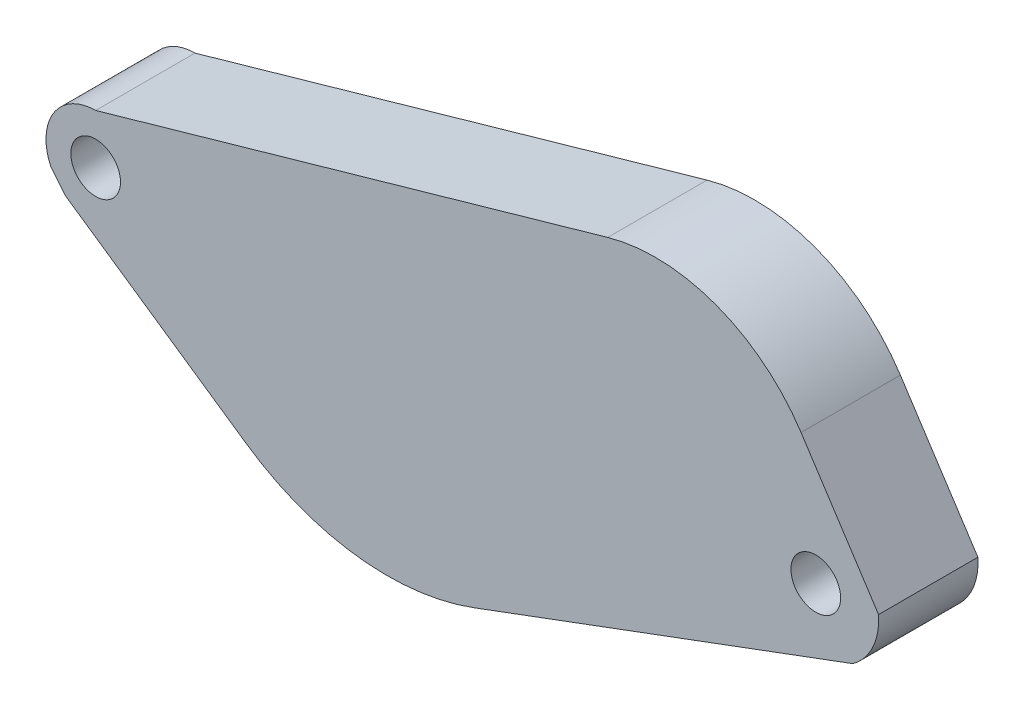
ISO-10303-21;
HEADER;
FILE_DESCRIPTION(('STEP AP214'),'2;1');
FILE_NAME('part.step','',(''),(''),'','','');
FILE_SCHEMA(('AUTOMOTIVE_DESIGN { 1 0 10303 214 1 1 1 1 }'));
ENDSEC;
DATA;
#1=APPLICATION_CONTEXT('core data for automotive mechanical design processes');
#2=APPLICATION_PROTOCOL_DEFINITION('international standard','automotive_design',2000,#1);
#3=PRODUCT_CONTEXT('',#1,'mechanical');
#4=PRODUCT('Part','Part','',(#3));
#5=PRODUCT_RELATED_PRODUCT_CATEGORY('part','',(#4));
#6=PRODUCT_DEFINITION_FORMATION('','',#4);
#7=PRODUCT_DEFINITION_CONTEXT('part definition',#1,'design');
#8=PRODUCT_DEFINITION('design','',#6,#7);
#9=PRODUCT_DEFINITION_SHAPE('','',#8);
#10=(LENGTH_UNIT() NAMED_UNIT(*) SI_UNIT(.MILLI.,.METRE.));
#11=(NAMED_UNIT(*) PLANE_ANGLE_UNIT() SI_UNIT($,.RADIAN.));
#12=(NAMED_UNIT(*) SI_UNIT($,.STERADIAN.) SOLID_ANGLE_UNIT());
#13=UNCERTAINTY_MEASURE_WITH_UNIT(LENGTH_MEASURE(1.E-05),#10,'distance_accuracy_value','');
#14=(GEOMETRIC_REPRESENTATION_CONTEXT(3) GLOBAL_UNCERTAINTY_ASSIGNED_CONTEXT((#13)) GLOBAL_UNIT_ASSIGNED_CONTEXT((#10,
#11,#12)) REPRESENTATION_CONTEXT('',''));
#15=CARTESIAN_POINT('',(0.,0.,0.));
#16=DIRECTION('',(0.,0.,1.));
#17=DIRECTION('',(1.,0.,0.));
#18=AXIS2_PLACEMENT_3D('',#15,#16,#17);
#19=CARTESIAN_POINT('',(-13.025069637883,0.,4.));
#20=DIRECTION('',(0.,0.,1.));
#21=DIRECTION('',(1.,0.,0.));
#22=AXIS2_PLACEMENT_3D('',#19,#20,#21);
#23=PLANE('',#22);
#24=CARTESIAN_POINT('',(15.974930362117,0.,4.));
#25=DIRECTION('',(0.,0.,1.));
#26=DIRECTION('',(1.,0.,0.));
#27=AXIS2_PLACEMENT_3D('',#24,#25,#26);
#28=CIRCLE('',#27,1.);
#29=CARTESIAN_POINT('',(16.974930362117,0.,4.));
#30=VERTEX_POINT('',#29);
#31=EDGE_CURVE('E140',#30,#30,#28,.T.);
#32=ORIENTED_EDGE('',*,*,#31,.F.);
#33=EDGE_LOOP('',(#32));
#34=FACE_BOUND('',#33,.T.);
#35=CARTESIAN_POINT('',(-13.025069637883,0.,4.));
#36=DIRECTION('',(0.,0.,1.));
#37=DIRECTION('',(1.,0.,0.));
#38=AXIS2_PLACEMENT_3D('',#35,#36,#37);
#39=CIRCLE('',#38,2.);
#40=CARTESIAN_POINT('',(-13.025069637883,2.,4.));
#41=VERTEX_POINT('',#40);
#42=CARTESIAN_POINT('',(-14.8289305494057,-0.863762589998384,4.));
#43=VERTEX_POINT('',#42);
#44=EDGE_CURVE('E153',#41,#43,#39,.T.);
#45=ORIENTED_EDGE('',*,*,#44,.T.);
#46=DIRECTION('',(0.626407335508904,-0.779495894806788,0.));
#47=VECTOR('',#46,1.);
#48=CARTESIAN_POINT('',(-14.257280667653,-1.57511878082417,4.));
#49=LINE('',#48,#47);
#50=CARTESIAN_POINT('',(-14.257280667653,-1.57511878082417,4.));
#51=VERTEX_POINT('',#50);
#52=EDGE_CURVE('E96',#43,#51,#49,.T.);
#53=ORIENTED_EDGE('',*,*,#52,.T.);
#54=DIRECTION('',(0.824396805449491,-0.566012285347831,0.));
#55=VECTOR('',#54,1.);
#56=CARTESIAN_POINT('',(-6.93992155751117,-6.59905279568727,4.));
#57=LINE('',#56,#55);
#58=CARTESIAN_POINT('',(-6.93992155751117,-6.59905279568727,4.));
#59=VERTEX_POINT('',#58);
#60=EDGE_CURVE('E171',#51,#59,#57,.T.);
#61=ORIENTED_EDGE('',*,*,#60,.T.);
#62=CARTESIAN_POINT('',(-1.27979870403282,1.64491525880762,4.));
#63=DIRECTION('',(0.,0.,1.));
#64=DIRECTION('',(-1.,0.,0.));
#65=AXIS2_PLACEMENT_3D('',#62,#63,#64);
#66=CIRCLE('',#65,10.);
#67=CARTESIAN_POINT('',(2.20856945054554,-7.72691954650792,4.));
#68=VERTEX_POINT('',#67);
#69=EDGE_CURVE('E188',#59,#68,#66,.T.);
#70=ORIENTED_EDGE('',*,*,#69,.T.);
#71=DIRECTION('',(0.937183480531554,0.348836815457832,0.));
#72=VECTOR('',#71,1.);
#73=CARTESIAN_POINT('',(2.20856945054553,-7.72691954650792,4.));
#74=LINE('',#73,#72);
#75=CARTESIAN_POINT('',(17.4717578114785,-2.04568195305289,4.));
#76=VERTEX_POINT('',#75);
#77=EDGE_CURVE('E187',#68,#76,#74,.T.);
#78=ORIENTED_EDGE('',*,*,#77,.T.);
#79=CARTESIAN_POINT('',(15.974930362117,0.,4.));
#80=DIRECTION('',(0.,0.,1.));
#81=DIRECTION('',(1.,0.,0.));
#82=AXIS2_PLACEMENT_3D('',#79,#80,#81);
#83=CIRCLE('',#82,2.53481894150418);
#84=CARTESIAN_POINT('',(18.5031911162721,0.182221363202154,4.));
#85=VERTEX_POINT('',#84);
#86=EDGE_CURVE('E118',#76,#85,#83,.T.);
#87=ORIENTED_EDGE('',*,*,#86,.T.);
#88=DIRECTION('',(-0.5459134761427,0.837841558151536,0.));
#89=VECTOR('',#88,1.);
#90=CARTESIAN_POINT('',(15.3821406206207,4.97225847461917,4.));
#91=LINE('',#90,#89);
#92=CARTESIAN_POINT('',(15.3821406206207,4.97225847461917,4.));
#93=VERTEX_POINT('',#92);
#94=EDGE_CURVE('E112',#85,#93,#91,.T.);
#95=ORIENTED_EDGE('',*,*,#94,.T.);
#96=CARTESIAN_POINT('',(9.51724971355995,1.1508641416203,4.));
#97=DIRECTION('',(0.,0.,1.));
#98=DIRECTION('',(-1.,0.,0.));
#99=AXIS2_PLACEMENT_3D('',#96,#97,#98);
#100=CIRCLE('',#99,7.);
#101=CARTESIAN_POINT('',(7.59712609133932,7.88236659466823,4.));
#102=VERTEX_POINT('',#101);
#103=EDGE_CURVE('E116',#93,#102,#100,.T.);
#104=ORIENTED_EDGE('',*,*,#103,.T.);
#105=DIRECTION('',(-0.961643207578277,-0.274303374602942,0.));
#106=VECTOR('',#105,1.);
#107=CARTESIAN_POINT('',(-13.025069637883,2.,4.));
#108=LINE('',#107,#106);
#109=EDGE_CURVE('E50',#102,#41,#108,.T.);
#110=ORIENTED_EDGE('',*,*,#109,.T.);
#111=EDGE_LOOP('',(#45,#53,#61,#70,#78,#87,#95,#104,#110));
#112=FACE_BOUND('',#111,.T.);
#113=CARTESIAN_POINT('',(-13.025069637883,0.,4.));
#114=DIRECTION('',(0.,0.,1.));
#115=DIRECTION('',(1.,0.,0.));
#116=AXIS2_PLACEMENT_3D('',#113,#114,#115);
#117=CIRCLE('',#116,1.);
#118=CARTESIAN_POINT('',(-12.025069637883,0.,4.));
#119=VERTEX_POINT('',#118);
#120=EDGE_CURVE('E198',#119,#119,#117,.T.);
#121=ORIENTED_EDGE('',*,*,#120,.F.);
#122=EDGE_LOOP('',(#121));
#123=FACE_BOUND('',#122,.T.);
#124=ADVANCED_FACE('F33',(#34,#112,#123),#23,.T.);
#125=CARTESIAN_POINT('',(-13.025069637883,0.,0.));
#126=DIRECTION('',(0.,0.,1.));
#127=DIRECTION('',(1.,0.,0.));
#128=AXIS2_PLACEMENT_3D('',#125,#126,#127);
#129=PLANE('',#128);
#130=CARTESIAN_POINT('',(-13.025069637883,0.,0.));
#131=DIRECTION('',(0.,0.,1.));
#132=DIRECTION('',(1.,0.,0.));
#133=AXIS2_PLACEMENT_3D('',#130,#131,#132);
#134=CIRCLE('',#133,2.);
#135=CARTESIAN_POINT('',(-13.025069637883,2.,0.));
#136=VERTEX_POINT('',#135);
#137=CARTESIAN_POINT('',(-14.8289305494057,-0.863762589998384,0.));
#138=VERTEX_POINT('',#137);
#139=EDGE_CURVE('E136',#136,#138,#134,.T.);
#140=ORIENTED_EDGE('',*,*,#139,.F.);
#141=DIRECTION('',(-0.961643207578277,-0.274303374602942,0.));
#142=VECTOR('',#141,1.);
#143=CARTESIAN_POINT('',(-13.025069637883,2.,0.));
#144=LINE('',#143,#142);
#145=CARTESIAN_POINT('',(7.59712609133932,7.88236659466823,0.));
#146=VERTEX_POINT('',#145);
#147=EDGE_CURVE('E88',#146,#136,#144,.T.);
#148=ORIENTED_EDGE('',*,*,#147,.F.);
#149=CARTESIAN_POINT('',(9.51724971355995,1.1508641416203,0.));
#150=DIRECTION('',(0.,0.,1.));
#151=DIRECTION('',(-1.,0.,0.));
#152=AXIS2_PLACEMENT_3D('',#149,#150,#151);
#153=CIRCLE('',#152,7.);
#154=CARTESIAN_POINT('',(15.3821406206207,4.97225847461917,0.));
#155=VERTEX_POINT('',#154);
#156=EDGE_CURVE('E82',#155,#146,#153,.T.);
#157=ORIENTED_EDGE('',*,*,#156,.F.);
#158=DIRECTION('',(-0.5459134761427,0.837841558151536,0.));
#159=VECTOR('',#158,1.);
#160=CARTESIAN_POINT('',(15.3821406206207,4.97225847461917,0.));
#161=LINE('',#160,#159);
#162=CARTESIAN_POINT('',(18.5031911162721,0.182221363202154,0.));
#163=VERTEX_POINT('',#162);
#164=EDGE_CURVE('E126',#163,#155,#161,.T.);
#165=ORIENTED_EDGE('',*,*,#164,.F.);
#166=CARTESIAN_POINT('',(15.974930362117,0.,0.));
#167=DIRECTION('',(0.,0.,1.));
#168=DIRECTION('',(1.,0.,0.));
#169=AXIS2_PLACEMENT_3D('',#166,#167,#168);
#170=CIRCLE('',#169,2.53481894150418);
#171=CARTESIAN_POINT('',(17.4717578114785,-2.04568195305289,0.));
#172=VERTEX_POINT('',#171);
#173=EDGE_CURVE('E148',#172,#163,#170,.T.);
#174=ORIENTED_EDGE('',*,*,#173,.F.);
#175=DIRECTION('',(0.937183480531554,0.348836815457832,0.));
#176=VECTOR('',#175,1.);
#177=CARTESIAN_POINT('',(2.20856945054553,-7.72691954650792,0.));
#178=LINE('',#177,#176);
#179=CARTESIAN_POINT('',(2.20856945054554,-7.72691954650792,0.));
#180=VERTEX_POINT('',#179);
#181=EDGE_CURVE('E146',#180,#172,#178,.T.);
#182=ORIENTED_EDGE('',*,*,#181,.F.);
#183=CARTESIAN_POINT('',(-1.27979870403282,1.64491525880762,0.));
#184=DIRECTION('',(0.,0.,1.));
#185=DIRECTION('',(-1.,0.,0.));
#186=AXIS2_PLACEMENT_3D('',#183,#184,#185);
#187=CIRCLE('',#186,10.);
#188=CARTESIAN_POINT('',(-6.93992155751117,-6.59905279568727,0.));
#189=VERTEX_POINT('',#188);
#190=EDGE_CURVE('E144',#189,#180,#187,.T.);
#191=ORIENTED_EDGE('',*,*,#190,.F.);
#192=DIRECTION('',(0.824396805449491,-0.566012285347831,0.));
#193=VECTOR('',#192,1.);
#194=CARTESIAN_POINT('',(-6.93992155751117,-6.59905279568727,0.));
#195=LINE('',#194,#193);
#196=CARTESIAN_POINT('',(-14.257280667653,-1.57511878082417,0.));
#197=VERTEX_POINT('',#196);
#198=EDGE_CURVE('E142',#197,#189,#195,.T.);
#199=ORIENTED_EDGE('',*,*,#198,.F.);
#200=DIRECTION('',(0.626407335508904,-0.779495894806788,0.));
#201=VECTOR('',#200,1.);
#202=CARTESIAN_POINT('',(-14.257280667653,-1.57511878082417,0.));
#203=LINE('',#202,#201);
#204=EDGE_CURVE('E139',#138,#197,#203,.T.);
#205=ORIENTED_EDGE('',*,*,#204,.F.);
#206=EDGE_LOOP('',(#140,#148,#157,#165,#174,#182,#191,#199,#205));
#207=FACE_BOUND('',#206,.T.);
#208=CARTESIAN_POINT('',(15.974930362117,0.,0.));
#209=DIRECTION('',(0.,0.,1.));
#210=DIRECTION('',(1.,0.,0.));
#211=AXIS2_PLACEMENT_3D('',#208,#209,#210);
#212=CIRCLE('',#211,1.);
#213=CARTESIAN_POINT('',(16.974930362117,0.,0.));
#214=VERTEX_POINT('',#213);
#215=EDGE_CURVE('E195',#214,#214,#212,.T.);
#216=ORIENTED_EDGE('',*,*,#215,.T.);
#217=EDGE_LOOP('',(#216));
#218=FACE_BOUND('',#217,.T.);
#219=CARTESIAN_POINT('',(-13.025069637883,0.,0.));
#220=DIRECTION('',(0.,0.,1.));
#221=DIRECTION('',(1.,0.,0.));
#222=AXIS2_PLACEMENT_3D('',#219,#220,#221);
#223=CIRCLE('',#222,1.);
#224=CARTESIAN_POINT('',(-12.025069637883,0.,0.));
#225=VERTEX_POINT('',#224);
#226=EDGE_CURVE('E201',#225,#225,#223,.T.);
#227=ORIENTED_EDGE('',*,*,#226,.T.);
#228=EDGE_LOOP('',(#227));
#229=FACE_BOUND('',#228,.T.);
#230=ADVANCED_FACE('F175',(#207,#218,#229),#129,.F.);
#231=CARTESIAN_POINT('',(-13.025069637883,0.,4.));
#232=DIRECTION('',(0.,0.,-1.));
#233=DIRECTION('',(-1.,0.,0.));
#234=AXIS2_PLACEMENT_3D('',#231,#232,#233);
#235=CYLINDRICAL_SURFACE('',#234,2.);
#236=ORIENTED_EDGE('',*,*,#139,.T.);
#237=DIRECTION('',(0.,0.,-1.));
#238=VECTOR('',#237,1.);
#239=CARTESIAN_POINT('',(-14.8289305494057,-0.863762589998384,4.));
#240=LINE('',#239,#238);
#241=EDGE_CURVE('E11',#43,#138,#240,.T.);
#242=ORIENTED_EDGE('',*,*,#241,.F.);
#243=ORIENTED_EDGE('',*,*,#44,.F.);
#244=DIRECTION('',(0.,0.,-1.));
#245=VECTOR('',#244,1.);
#246=CARTESIAN_POINT('',(-13.025069637883,2.,4.));
#247=LINE('',#246,#245);
#248=EDGE_CURVE('E132',#41,#136,#247,.T.);
#249=ORIENTED_EDGE('',*,*,#248,.T.);
#250=EDGE_LOOP('',(#236,#242,#243,#249));
#251=FACE_BOUND('',#250,.T.);
#252=ADVANCED_FACE('F35',(#251),#235,.T.);
#253=CARTESIAN_POINT('',(-14.257280667653,-1.57511878082417,4.));
#254=DIRECTION('',(0.779495894806788,0.626407335508904,0.));
#255=DIRECTION('',(-0.626407335508904,0.779495894806788,0.));
#256=AXIS2_PLACEMENT_3D('',#253,#254,#255);
#257=PLANE('',#256);
#258=ORIENTED_EDGE('',*,*,#204,.T.);
#259=DIRECTION('',(0.,0.,-1.));
#260=VECTOR('',#259,1.);
#261=CARTESIAN_POINT('',(-14.257280667653,-1.57511878082417,4.));
#262=LINE('',#261,#260);
#263=EDGE_CURVE('E42',#51,#197,#262,.T.);
#264=ORIENTED_EDGE('',*,*,#263,.F.);
#265=ORIENTED_EDGE('',*,*,#52,.F.);
#266=ORIENTED_EDGE('',*,*,#241,.T.);
#267=EDGE_LOOP('',(#258,#264,#265,#266));
#268=FACE_BOUND('',#267,.T.);
#269=ADVANCED_FACE('F237',(#268),#257,.F.);
#270=CARTESIAN_POINT('',(-6.93992155751117,-6.59905279568727,4.));
#271=DIRECTION('',(0.566012285347831,0.824396805449491,0.));
#272=DIRECTION('',(-0.824396805449491,0.566012285347831,0.));
#273=AXIS2_PLACEMENT_3D('',#270,#271,#272);
#274=PLANE('',#273);
#275=ORIENTED_EDGE('',*,*,#198,.T.);
#276=DIRECTION('',(0.,0.,-1.));
#277=VECTOR('',#276,1.);
#278=CARTESIAN_POINT('',(-6.93992155751117,-6.59905279568727,4.));
#279=LINE('',#278,#277);
#280=EDGE_CURVE('E163',#59,#189,#279,.T.);
#281=ORIENTED_EDGE('',*,*,#280,.F.);
#282=ORIENTED_EDGE('',*,*,#60,.F.);
#283=ORIENTED_EDGE('',*,*,#263,.T.);
#284=EDGE_LOOP('',(#275,#281,#282,#283));
#285=FACE_BOUND('',#284,.T.);
#286=ADVANCED_FACE('F169',(#285),#274,.F.);
#287=CARTESIAN_POINT('',(-1.27979870403282,1.64491525880762,4.));
#288=DIRECTION('',(0.,0.,-1.));
#289=DIRECTION('',(-1.,0.,0.));
#290=AXIS2_PLACEMENT_3D('',#287,#288,#289);
#291=CYLINDRICAL_SURFACE('',#290,10.);
#292=ORIENTED_EDGE('',*,*,#190,.T.);
#293=DIRECTION('',(0.,0.,-1.));
#294=VECTOR('',#293,1.);
#295=CARTESIAN_POINT('',(2.20856945054554,-7.72691954650792,4.));
#296=LINE('',#295,#294);
#297=EDGE_CURVE('E160',#68,#180,#296,.T.);
#298=ORIENTED_EDGE('',*,*,#297,.F.);
#299=ORIENTED_EDGE('',*,*,#69,.F.);
#300=ORIENTED_EDGE('',*,*,#280,.T.);
#301=EDGE_LOOP('',(#292,#298,#299,#300));
#302=FACE_BOUND('',#301,.T.);
#303=ADVANCED_FACE('F181',(#302),#291,.T.);
#304=CARTESIAN_POINT('',(2.20856945054553,-7.72691954650792,4.));
#305=DIRECTION('',(-0.348836815457832,0.937183480531555,0.));
#306=DIRECTION('',(-0.937183480531555,-0.348836815457832,0.));
#307=AXIS2_PLACEMENT_3D('',#304,#305,#306);
#308=PLANE('',#307);
#309=ORIENTED_EDGE('',*,*,#181,.T.);
#310=DIRECTION('',(0.,0.,-1.));
#311=VECTOR('',#310,1.);
#312=CARTESIAN_POINT('',(17.4717578114785,-2.04568195305289,4.));
#313=LINE('',#312,#311);
#314=EDGE_CURVE('E157',#76,#172,#313,.T.);
#315=ORIENTED_EDGE('',*,*,#314,.F.);
#316=ORIENTED_EDGE('',*,*,#77,.F.);
#317=ORIENTED_EDGE('',*,*,#297,.T.);
#318=EDGE_LOOP('',(#309,#315,#316,#317));
#319=FACE_BOUND('',#318,.T.);
#320=ADVANCED_FACE('F185',(#319),#308,.F.);
#321=CARTESIAN_POINT('',(15.974930362117,0.,4.));
#322=DIRECTION('',(0.,0.,-1.));
#323=DIRECTION('',(-1.,0.,0.));
#324=AXIS2_PLACEMENT_3D('',#321,#322,#323);
#325=CYLINDRICAL_SURFACE('',#324,2.53481894150418);
#326=ORIENTED_EDGE('',*,*,#173,.T.);
#327=DIRECTION('',(0.,0.,-1.));
#328=VECTOR('',#327,1.);
#329=CARTESIAN_POINT('',(18.5031911162721,0.182221363202154,4.));
#330=LINE('',#329,#328);
#331=EDGE_CURVE('E127',#85,#163,#330,.T.);
#332=ORIENTED_EDGE('',*,*,#331,.F.);
#333=ORIENTED_EDGE('',*,*,#86,.F.);
#334=ORIENTED_EDGE('',*,*,#314,.T.);
#335=EDGE_LOOP('',(#326,#332,#333,#334));
#336=FACE_BOUND('',#335,.T.);
#337=ADVANCED_FACE('F228',(#336),#325,.T.);
#338=CARTESIAN_POINT('',(15.3821406206207,4.97225847461917,4.));
#339=DIRECTION('',(-0.837841558151536,-0.5459134761427,0.));
#340=DIRECTION('',(0.5459134761427,-0.837841558151536,0.));
#341=AXIS2_PLACEMENT_3D('',#338,#339,#340);
#342=PLANE('',#341);
#343=ORIENTED_EDGE('',*,*,#164,.T.);
#344=DIRECTION('',(0.,0.,-1.));
#345=VECTOR('',#344,1.);
#346=CARTESIAN_POINT('',(15.3821406206207,4.97225847461917,4.));
#347=LINE('',#346,#345);
#348=EDGE_CURVE('E123',#93,#155,#347,.T.);
#349=ORIENTED_EDGE('',*,*,#348,.F.);
#350=ORIENTED_EDGE('',*,*,#94,.F.);
#351=ORIENTED_EDGE('',*,*,#331,.T.);
#352=EDGE_LOOP('',(#343,#349,#350,#351));
#353=FACE_BOUND('',#352,.T.);
#354=ADVANCED_FACE('F124',(#353),#342,.F.);
#355=CARTESIAN_POINT('',(9.51724971355995,1.1508641416203,4.));
#356=DIRECTION('',(0.,0.,-1.));
#357=DIRECTION('',(-1.,0.,0.));
#358=AXIS2_PLACEMENT_3D('',#355,#356,#357);
#359=CYLINDRICAL_SURFACE('',#358,7.);
#360=ORIENTED_EDGE('',*,*,#156,.T.);
#361=DIRECTION('',(0.,0.,-1.));
#362=VECTOR('',#361,1.);
#363=CARTESIAN_POINT('',(7.59712609133932,7.88236659466823,4.));
#364=LINE('',#363,#362);
#365=EDGE_CURVE('E128',#102,#146,#364,.T.);
#366=ORIENTED_EDGE('',*,*,#365,.F.);
#367=ORIENTED_EDGE('',*,*,#103,.F.);
#368=ORIENTED_EDGE('',*,*,#348,.T.);
#369=EDGE_LOOP('',(#360,#366,#367,#368));
#370=FACE_BOUND('',#369,.T.);
#371=ADVANCED_FACE('F130',(#370),#359,.T.);
#372=CARTESIAN_POINT('',(-13.025069637883,2.,4.));
#373=DIRECTION('',(0.274303374602942,-0.961643207578277,0.));
#374=DIRECTION('',(0.961643207578278,0.274303374602942,0.));
#375=AXIS2_PLACEMENT_3D('',#372,#373,#374);
#376=PLANE('',#375);
#377=ORIENTED_EDGE('',*,*,#147,.T.);
#378=ORIENTED_EDGE('',*,*,#248,.F.);
#379=ORIENTED_EDGE('',*,*,#109,.F.);
#380=ORIENTED_EDGE('',*,*,#365,.T.);
#381=EDGE_LOOP('',(#377,#378,#379,#380));
#382=FACE_BOUND('',#381,.T.);
#383=ADVANCED_FACE('F221',(#382),#376,.F.);
#384=CARTESIAN_POINT('',(15.974930362117,0.,4.));
#385=DIRECTION('',(0.,0.,-1.));
#386=DIRECTION('',(-1.,0.,0.));
#387=AXIS2_PLACEMENT_3D('',#384,#385,#386);
#388=CYLINDRICAL_SURFACE('',#387,1.);
#389=ORIENTED_EDGE('',*,*,#31,.T.);
#390=EDGE_LOOP('',(#389));
#391=FACE_BOUND('',#390,.T.);
#392=ORIENTED_EDGE('',*,*,#215,.F.);
#393=EDGE_LOOP('',(#392));
#394=FACE_BOUND('',#393,.T.);
#395=ADVANCED_FACE('F218',(#391,#394),#388,.F.);
#396=CARTESIAN_POINT('',(-13.025069637883,0.,4.));
#397=DIRECTION('',(0.,0.,-1.));
#398=DIRECTION('',(-1.,0.,0.));
#399=AXIS2_PLACEMENT_3D('',#396,#397,#398);
#400=CYLINDRICAL_SURFACE('',#399,1.);
#401=ORIENTED_EDGE('',*,*,#120,.T.);
#402=EDGE_LOOP('',(#401));
#403=FACE_BOUND('',#402,.T.);
#404=ORIENTED_EDGE('',*,*,#226,.F.);
#405=EDGE_LOOP('',(#404));
#406=FACE_BOUND('',#405,.T.);
#407=ADVANCED_FACE('F207',(#403,#406),#400,.F.);
#408=CLOSED_SHELL('',(#124,#230,#252,#269,#286,#303,#320,#337,#354,#371,#383,#395,#407));
#409=MANIFOLD_SOLID_BREP('B2',#408);
#410=ADVANCED_BREP_SHAPE_REPRESENTATION('',(#18,#409),#14);
#411=SHAPE_DEFINITION_REPRESENTATION(#9,#410);
ENDSEC;
END-ISO-10303-21;
